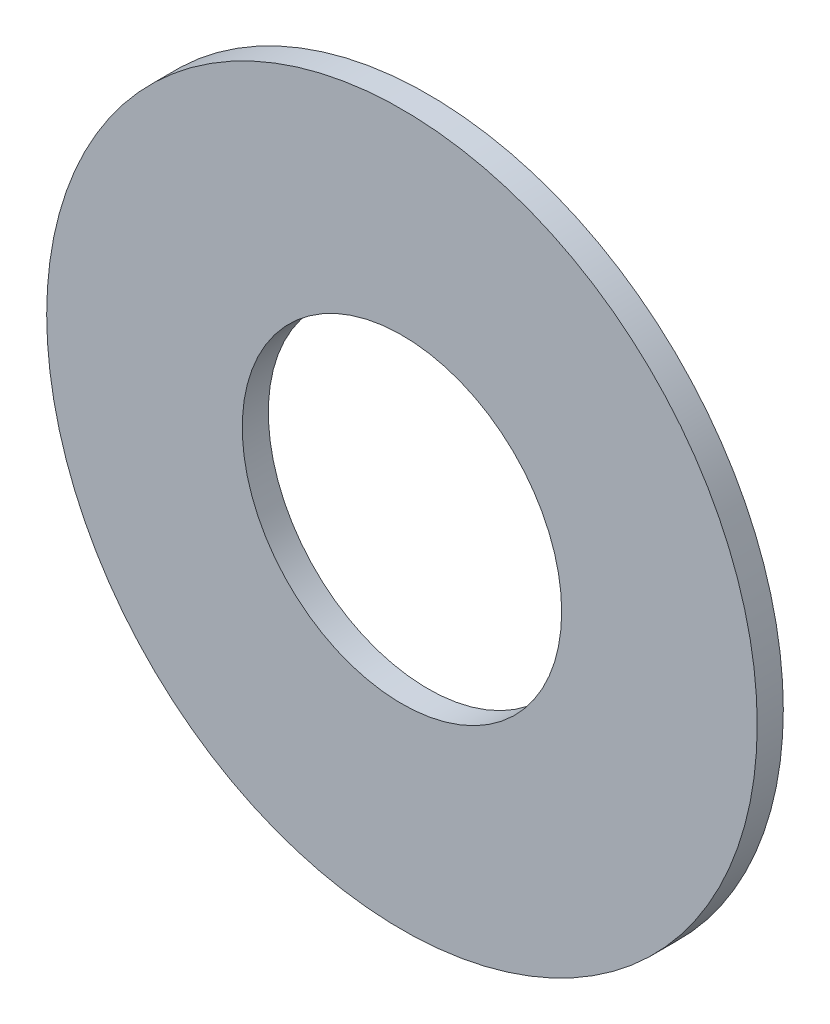
ISO-10303-21;
HEADER;
FILE_DESCRIPTION(('STEP AP214'),'2;1');
FILE_NAME('part.step','',(''),(''),'','','');
FILE_SCHEMA(('AUTOMOTIVE_DESIGN { 1 0 10303 214 1 1 1 1 }'));
ENDSEC;
DATA;
#1=APPLICATION_CONTEXT('core data for automotive mechanical design processes');
#2=APPLICATION_PROTOCOL_DEFINITION('international standard','automotive_design',2000,#1);
#3=PRODUCT_CONTEXT('',#1,'mechanical');
#4=PRODUCT('Part','Part','',(#3));
#5=PRODUCT_RELATED_PRODUCT_CATEGORY('part','',(#4));
#6=PRODUCT_DEFINITION_FORMATION('','',#4);
#7=PRODUCT_DEFINITION_CONTEXT('part definition',#1,'design');
#8=PRODUCT_DEFINITION('design','',#6,#7);
#9=PRODUCT_DEFINITION_SHAPE('','',#8);
#10=(LENGTH_UNIT() NAMED_UNIT(*) SI_UNIT(.MILLI.,.METRE.));
#11=(NAMED_UNIT(*) PLANE_ANGLE_UNIT() SI_UNIT($,.RADIAN.));
#12=(NAMED_UNIT(*) SI_UNIT($,.STERADIAN.) SOLID_ANGLE_UNIT());
#13=UNCERTAINTY_MEASURE_WITH_UNIT(LENGTH_MEASURE(1.E-05),#10,'distance_accuracy_value','');
#14=(GEOMETRIC_REPRESENTATION_CONTEXT(3) GLOBAL_UNCERTAINTY_ASSIGNED_CONTEXT((#13)) GLOBAL_UNIT_ASSIGNED_CONTEXT((#10,
#11,#12)) REPRESENTATION_CONTEXT('',''));
#15=CARTESIAN_POINT('',(0.,0.,0.));
#16=DIRECTION('',(0.,0.,1.));
#17=DIRECTION('',(1.,0.,0.));
#18=AXIS2_PLACEMENT_3D('',#15,#16,#17);
#19=CARTESIAN_POINT('',(0.,0.,0.8));
#20=DIRECTION('',(0.,0.,1.));
#21=DIRECTION('',(1.,0.,0.));
#22=AXIS2_PLACEMENT_3D('',#19,#20,#21);
#23=PLANE('',#22);
#24=CARTESIAN_POINT('',(0.,0.,0.8));
#25=DIRECTION('',(0.,0.,1.));
#26=DIRECTION('',(1.,0.,0.));
#27=AXIS2_PLACEMENT_3D('',#24,#25,#26);
#28=CIRCLE('',#27,10.9);
#29=CARTESIAN_POINT('',(10.9,0.,0.8));
#30=VERTEX_POINT('',#29);
#31=EDGE_CURVE('E10',#30,#30,#28,.T.);
#32=ORIENTED_EDGE('',*,*,#31,.T.);
#33=EDGE_LOOP('',(#32));
#34=FACE_BOUND('',#33,.T.);
#35=CARTESIAN_POINT('',(0.,0.,0.8));
#36=DIRECTION('',(0.,0.,1.));
#37=DIRECTION('',(1.,0.,0.));
#38=AXIS2_PLACEMENT_3D('',#35,#36,#37);
#39=CIRCLE('',#38,4.9);
#40=CARTESIAN_POINT('',(4.9,0.,0.8));
#41=VERTEX_POINT('',#40);
#42=EDGE_CURVE('E44',#41,#41,#39,.T.);
#43=ORIENTED_EDGE('',*,*,#42,.F.);
#44=EDGE_LOOP('',(#43));
#45=FACE_BOUND('',#44,.T.);
#46=ADVANCED_FACE('F33',(#34,#45),#23,.T.);
#47=CARTESIAN_POINT('',(0.,0.,0.));
#48=DIRECTION('',(0.,0.,1.));
#49=DIRECTION('',(1.,0.,0.));
#50=AXIS2_PLACEMENT_3D('',#47,#48,#49);
#51=PLANE('',#50);
#52=CARTESIAN_POINT('',(0.,0.,0.));
#53=DIRECTION('',(0.,0.,1.));
#54=DIRECTION('',(1.,0.,0.));
#55=AXIS2_PLACEMENT_3D('',#52,#53,#54);
#56=CIRCLE('',#55,10.9);
#57=CARTESIAN_POINT('',(10.9,0.,0.));
#58=VERTEX_POINT('',#57);
#59=EDGE_CURVE('E37',#58,#58,#56,.T.);
#60=ORIENTED_EDGE('',*,*,#59,.F.);
#61=EDGE_LOOP('',(#60));
#62=FACE_BOUND('',#61,.T.);
#63=CARTESIAN_POINT('',(0.,0.,0.));
#64=DIRECTION('',(0.,0.,1.));
#65=DIRECTION('',(1.,0.,0.));
#66=AXIS2_PLACEMENT_3D('',#63,#64,#65);
#67=CIRCLE('',#66,4.9);
#68=CARTESIAN_POINT('',(4.9,0.,0.));
#69=VERTEX_POINT('',#68);
#70=EDGE_CURVE('E46',#69,#69,#67,.T.);
#71=ORIENTED_EDGE('',*,*,#70,.T.);
#72=EDGE_LOOP('',(#71));
#73=FACE_BOUND('',#72,.T.);
#74=ADVANCED_FACE('F56',(#62,#73),#51,.F.);
#75=CARTESIAN_POINT('',(0.,0.,0.8));
#76=DIRECTION('',(0.,0.,-1.));
#77=DIRECTION('',(-1.,0.,0.));
#78=AXIS2_PLACEMENT_3D('',#75,#76,#77);
#79=CYLINDRICAL_SURFACE('',#78,10.9);
#80=ORIENTED_EDGE('',*,*,#31,.F.);
#81=EDGE_LOOP('',(#80));
#82=FACE_BOUND('',#81,.T.);
#83=ORIENTED_EDGE('',*,*,#59,.T.);
#84=EDGE_LOOP('',(#83));
#85=FACE_BOUND('',#84,.T.);
#86=ADVANCED_FACE('F35',(#82,#85),#79,.T.);
#87=CARTESIAN_POINT('',(0.,0.,0.8));
#88=DIRECTION('',(0.,0.,-1.));
#89=DIRECTION('',(-1.,0.,0.));
#90=AXIS2_PLACEMENT_3D('',#87,#88,#89);
#91=CYLINDRICAL_SURFACE('',#90,4.9);
#92=ORIENTED_EDGE('',*,*,#42,.T.);
#93=EDGE_LOOP('',(#92));
#94=FACE_BOUND('',#93,.T.);
#95=ORIENTED_EDGE('',*,*,#70,.F.);
#96=EDGE_LOOP('',(#95));
#97=FACE_BOUND('',#96,.T.);
#98=ADVANCED_FACE('F52',(#94,#97),#91,.F.);
#99=CLOSED_SHELL('',(#46,#74,#86,#98));
#100=MANIFOLD_SOLID_BREP('B2',#99);
#101=ADVANCED_BREP_SHAPE_REPRESENTATION('',(#18,#100),#14);
#102=SHAPE_DEFINITION_REPRESENTATION(#9,#101);
ENDSEC;
END-ISO-10303-21;
